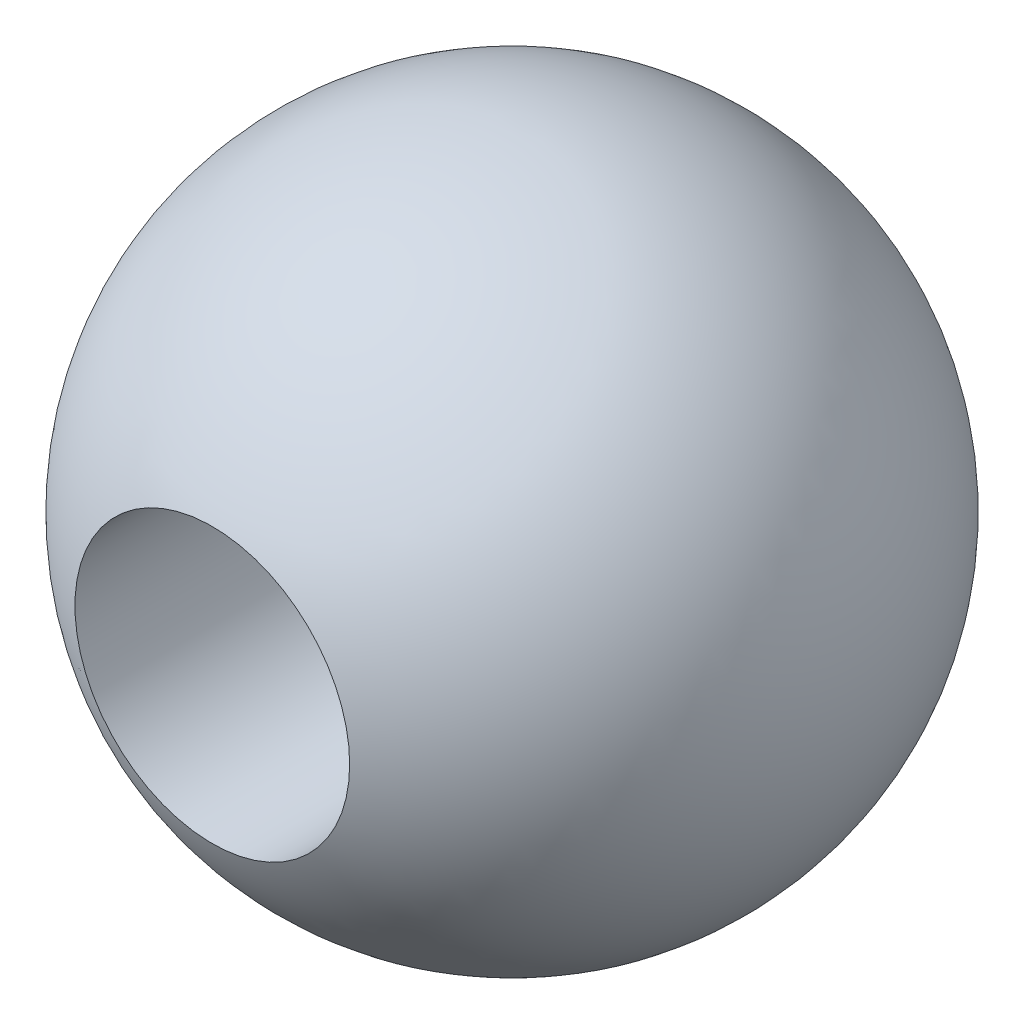
ISO-10303-21;
HEADER;
FILE_DESCRIPTION(('STEP AP214'),'2;1');
FILE_NAME('part.step','',(''),(''),'','','');
FILE_SCHEMA(('AUTOMOTIVE_DESIGN { 1 0 10303 214 1 1 1 1 }'));
ENDSEC;
DATA;
#1=APPLICATION_CONTEXT('core data for automotive mechanical design processes');
#2=APPLICATION_PROTOCOL_DEFINITION('international standard','automotive_design',2000,#1);
#3=PRODUCT_CONTEXT('',#1,'mechanical');
#4=PRODUCT('Part','Part','',(#3));
#5=PRODUCT_RELATED_PRODUCT_CATEGORY('part','',(#4));
#6=PRODUCT_DEFINITION_FORMATION('','',#4);
#7=PRODUCT_DEFINITION_CONTEXT('part definition',#1,'design');
#8=PRODUCT_DEFINITION('design','',#6,#7);
#9=PRODUCT_DEFINITION_SHAPE('','',#8);
#10=(LENGTH_UNIT() NAMED_UNIT(*) SI_UNIT(.MILLI.,.METRE.));
#11=(NAMED_UNIT(*) PLANE_ANGLE_UNIT() SI_UNIT($,.RADIAN.));
#12=(NAMED_UNIT(*) SI_UNIT($,.STERADIAN.) SOLID_ANGLE_UNIT());
#13=UNCERTAINTY_MEASURE_WITH_UNIT(LENGTH_MEASURE(1.E-05),#10,'distance_accuracy_value','');
#14=(GEOMETRIC_REPRESENTATION_CONTEXT(3) GLOBAL_UNCERTAINTY_ASSIGNED_CONTEXT((#13)) GLOBAL_UNIT_ASSIGNED_CONTEXT((#10,
#11,#12)) REPRESENTATION_CONTEXT('',''));
#15=CARTESIAN_POINT('',(0.,0.,0.));
#16=DIRECTION('',(0.,0.,1.));
#17=DIRECTION('',(1.,0.,0.));
#18=AXIS2_PLACEMENT_3D('',#15,#16,#17);
#19=CARTESIAN_POINT('',(0.,0.,-8.6587902516));
#20=DIRECTION('',(0.,0.,1.));
#21=DIRECTION('',(1.,0.,0.));
#22=AXIS2_PLACEMENT_3D('',#19,#20,#21);
#23=CYLINDRICAL_SURFACE('',#22,3.96875);
#24=CARTESIAN_POINT('',(0.,0.,8.6587902516));
#25=DIRECTION('',(0.,0.,1.));
#26=DIRECTION('',(1.,0.,0.));
#27=AXIS2_PLACEMENT_3D('',#24,#25,#26);
#28=CIRCLE('',#27,3.96875);
#29=CARTESIAN_POINT('',(3.96875,0.,8.6587902516));
#30=VERTEX_POINT('',#29);
#31=EDGE_CURVE('E11',#30,#30,#28,.T.);
#32=ORIENTED_EDGE('',*,*,#31,.T.);
#33=EDGE_LOOP('',(#32));
#34=FACE_BOUND('',#33,.T.);
#35=CARTESIAN_POINT('',(0.,0.,-8.6587902516));
#36=DIRECTION('',(0.,0.,1.));
#37=DIRECTION('',(1.,0.,0.));
#38=AXIS2_PLACEMENT_3D('',#35,#36,#37);
#39=CIRCLE('',#38,3.96875);
#40=CARTESIAN_POINT('',(3.96875,0.,-8.6587902516));
#41=VERTEX_POINT('',#40);
#42=EDGE_CURVE('E19',#41,#41,#39,.F.);
#43=ORIENTED_EDGE('',*,*,#42,.T.);
#44=EDGE_LOOP('',(#43));
#45=FACE_BOUND('',#44,.T.);
#46=ADVANCED_FACE('F16',(#34,#45),#23,.F.);
#47=CARTESIAN_POINT('',(0.,0.,0.));
#48=DIRECTION('',(0.,1.,0.));
#49=DIRECTION('',(-1.,0.,0.));
#50=AXIS2_PLACEMENT_3D('',#47,#48,#49);
#51=SPHERICAL_SURFACE('',#50,9.525);
#52=ORIENTED_EDGE('',*,*,#31,.F.);
#53=EDGE_LOOP('',(#52));
#54=FACE_BOUND('',#53,.T.);
#55=ORIENTED_EDGE('',*,*,#42,.F.);
#56=EDGE_LOOP('',(#55));
#57=FACE_BOUND('',#56,.T.);
#58=CARTESIAN_POINT('',(0.,9.525,0.));
#59=VERTEX_POINT('',#58);
#60=VERTEX_LOOP('',#59);
#61=FACE_BOUND('',#60,.T.);
#62=CARTESIAN_POINT('',(0.,-9.525,0.));
#63=VERTEX_POINT('',#62);
#64=VERTEX_LOOP('',#63);
#65=FACE_BOUND('',#64,.T.);
#66=ADVANCED_FACE('F30',(#54,#57,#61,#65),#51,.T.);
#67=CLOSED_SHELL('',(#46,#66));
#68=MANIFOLD_SOLID_BREP('B1',#67);
#69=ADVANCED_BREP_SHAPE_REPRESENTATION('',(#18,#68),#14);
#70=SHAPE_DEFINITION_REPRESENTATION(#9,#69);
ENDSEC;
END-ISO-10303-21;
